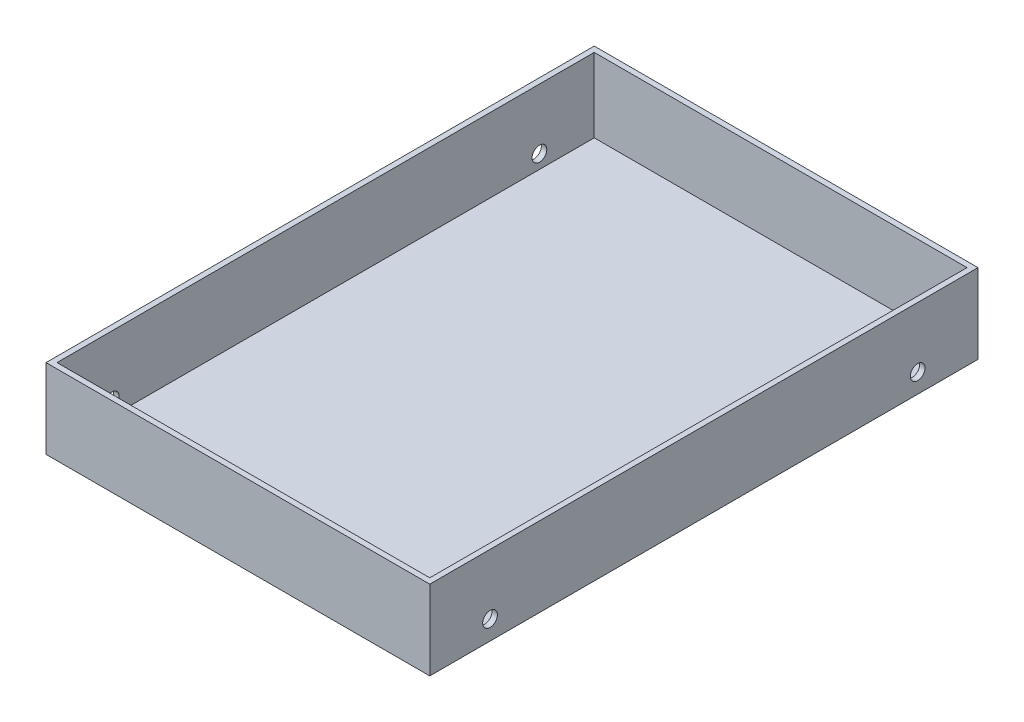
ISO-10303-21;
HEADER;
FILE_DESCRIPTION(('STEP AP214'),'2;1');
FILE_NAME('part.step','',(''),(''),'','','');
FILE_SCHEMA(('AUTOMOTIVE_DESIGN { 1 0 10303 214 1 1 1 1 }'));
ENDSEC;
DATA;
#1=APPLICATION_CONTEXT('core data for automotive mechanical design processes');
#2=APPLICATION_PROTOCOL_DEFINITION('international standard','automotive_design',2000,#1);
#3=PRODUCT_CONTEXT('',#1,'mechanical');
#4=PRODUCT('Part','Part','',(#3));
#5=PRODUCT_RELATED_PRODUCT_CATEGORY('part','',(#4));
#6=PRODUCT_DEFINITION_FORMATION('','',#4);
#7=PRODUCT_DEFINITION_CONTEXT('part definition',#1,'design');
#8=PRODUCT_DEFINITION('design','',#6,#7);
#9=PRODUCT_DEFINITION_SHAPE('','',#8);
#10=(LENGTH_UNIT() NAMED_UNIT(*) SI_UNIT(.MILLI.,.METRE.));
#11=(NAMED_UNIT(*) PLANE_ANGLE_UNIT() SI_UNIT($,.RADIAN.));
#12=(NAMED_UNIT(*) SI_UNIT($,.STERADIAN.) SOLID_ANGLE_UNIT());
#13=UNCERTAINTY_MEASURE_WITH_UNIT(LENGTH_MEASURE(1.E-05),#10,'distance_accuracy_value','');
#14=(GEOMETRIC_REPRESENTATION_CONTEXT(3) GLOBAL_UNCERTAINTY_ASSIGNED_CONTEXT((#13)) GLOBAL_UNIT_ASSIGNED_CONTEXT((#10,
#11,#12)) REPRESENTATION_CONTEXT('',''));
#15=CARTESIAN_POINT('',(0.,0.,0.));
#16=DIRECTION('',(0.,0.,1.));
#17=DIRECTION('',(1.,0.,0.));
#18=AXIS2_PLACEMENT_3D('',#15,#16,#17);
#19=CARTESIAN_POINT('',(0.,72.5,0.));
#20=DIRECTION('',(0.,-1.,0.));
#21=DIRECTION('',(0.,0.,-1.));
#22=AXIS2_PLACEMENT_3D('',#19,#20,#21);
#23=PLANE('',#22);
#24=DIRECTION('',(0.,0.,-1.));
#25=VECTOR('',#24,1.);
#26=CARTESIAN_POINT('',(175.,72.5,250.));
#27=LINE('',#26,#25);
#28=CARTESIAN_POINT('',(175.,72.5,250.));
#29=VERTEX_POINT('',#28);
#30=CARTESIAN_POINT('',(175.,72.5,-250.));
#31=VERTEX_POINT('',#30);
#32=EDGE_CURVE('E143',#29,#31,#27,.T.);
#33=ORIENTED_EDGE('',*,*,#32,.T.);
#34=DIRECTION('',(-1.,0.,0.));
#35=VECTOR('',#34,1.);
#36=CARTESIAN_POINT('',(-175.,72.5,-250.));
#37=LINE('',#36,#35);
#38=CARTESIAN_POINT('',(-175.,72.5,-250.));
#39=VERTEX_POINT('',#38);
#40=EDGE_CURVE('E87',#31,#39,#37,.T.);
#41=ORIENTED_EDGE('',*,*,#40,.T.);
#42=DIRECTION('',(0.,0.,1.));
#43=VECTOR('',#42,1.);
#44=CARTESIAN_POINT('',(-175.,72.5,250.));
#45=LINE('',#44,#43);
#46=CARTESIAN_POINT('',(-175.,72.5,250.));
#47=VERTEX_POINT('',#46);
#48=EDGE_CURVE('E146',#39,#47,#45,.T.);
#49=ORIENTED_EDGE('',*,*,#48,.T.);
#50=DIRECTION('',(1.,0.,0.));
#51=VECTOR('',#50,1.);
#52=CARTESIAN_POINT('',(-175.,72.5,250.));
#53=LINE('',#52,#51);
#54=EDGE_CURVE('E59',#47,#29,#53,.T.);
#55=ORIENTED_EDGE('',*,*,#54,.T.);
#56=EDGE_LOOP('',(#33,#41,#49,#55));
#57=FACE_BOUND('',#56,.T.);
#58=DIRECTION('',(0.,0.,-1.));
#59=VECTOR('',#58,1.);
#60=CARTESIAN_POINT('',(170.,72.5,0.));
#61=LINE('',#60,#59);
#62=CARTESIAN_POINT('',(170.,72.5,245.));
#63=VERTEX_POINT('',#62);
#64=CARTESIAN_POINT('',(170.,72.5,-245.));
#65=VERTEX_POINT('',#64);
#66=EDGE_CURVE('E132',#63,#65,#61,.T.);
#67=ORIENTED_EDGE('',*,*,#66,.F.);
#68=DIRECTION('',(1.,0.,0.));
#69=VECTOR('',#68,1.);
#70=CARTESIAN_POINT('',(0.,72.5,245.));
#71=LINE('',#70,#69);
#72=CARTESIAN_POINT('',(-170.,72.5,245.));
#73=VERTEX_POINT('',#72);
#74=EDGE_CURVE('E141',#73,#63,#71,.T.);
#75=ORIENTED_EDGE('',*,*,#74,.F.);
#76=DIRECTION('',(0.,0.,1.));
#77=VECTOR('',#76,1.);
#78=CARTESIAN_POINT('',(-170.,72.5,0.));
#79=LINE('',#78,#77);
#80=CARTESIAN_POINT('',(-170.,72.5,-245.));
#81=VERTEX_POINT('',#80);
#82=EDGE_CURVE('E139',#81,#73,#79,.T.);
#83=ORIENTED_EDGE('',*,*,#82,.F.);
#84=DIRECTION('',(-1.,0.,0.));
#85=VECTOR('',#84,1.);
#86=CARTESIAN_POINT('',(0.,72.5,-245.));
#87=LINE('',#86,#85);
#88=EDGE_CURVE('E124',#65,#81,#87,.T.);
#89=ORIENTED_EDGE('',*,*,#88,.F.);
#90=EDGE_LOOP('',(#67,#75,#83,#89));
#91=FACE_BOUND('',#90,.T.);
#92=ADVANCED_FACE('F33',(#57,#91),#23,.F.);
#93=CARTESIAN_POINT('',(175.,72.5,250.));
#94=DIRECTION('',(-1.,0.,0.));
#95=DIRECTION('',(0.,0.,1.));
#96=AXIS2_PLACEMENT_3D('',#93,#94,#95);
#97=PLANE('',#96);
#98=CARTESIAN_POINT('',(175.,17.5,195.));
#99=DIRECTION('',(-1.,0.,0.));
#100=DIRECTION('',(0.,0.,1.));
#101=AXIS2_PLACEMENT_3D('',#98,#99,#100);
#102=CIRCLE('',#101,6.7231310807878);
#103=CARTESIAN_POINT('',(175.,17.5,201.723131080788));
#104=VERTEX_POINT('',#103);
#105=EDGE_CURVE('E184',#104,#104,#102,.T.);
#106=ORIENTED_EDGE('',*,*,#105,.T.);
#107=EDGE_LOOP('',(#106));
#108=FACE_BOUND('',#107,.T.);
#109=CARTESIAN_POINT('',(175.,17.5,-195.));
#110=DIRECTION('',(-1.,0.,0.));
#111=DIRECTION('',(0.,0.,1.));
#112=AXIS2_PLACEMENT_3D('',#109,#110,#111);
#113=CIRCLE('',#112,6.7231310807878);
#114=CARTESIAN_POINT('',(175.,17.5,-188.276868919212));
#115=VERTEX_POINT('',#114);
#116=EDGE_CURVE('E169',#115,#115,#113,.T.);
#117=ORIENTED_EDGE('',*,*,#116,.T.);
#118=EDGE_LOOP('',(#117));
#119=FACE_BOUND('',#118,.T.);
#120=DIRECTION('',(0.,0.,-1.));
#121=VECTOR('',#120,1.);
#122=CARTESIAN_POINT('',(175.,0.,250.));
#123=LINE('',#122,#121);
#124=CARTESIAN_POINT('',(175.,0.,250.));
#125=VERTEX_POINT('',#124);
#126=CARTESIAN_POINT('',(175.,0.,-250.));
#127=VERTEX_POINT('',#126);
#128=EDGE_CURVE('E150',#125,#127,#123,.T.);
#129=ORIENTED_EDGE('',*,*,#128,.T.);
#130=DIRECTION('',(0.,-1.,0.));
#131=VECTOR('',#130,1.);
#132=CARTESIAN_POINT('',(175.,72.5,-250.));
#133=LINE('',#132,#131);
#134=EDGE_CURVE('E11',#31,#127,#133,.T.);
#135=ORIENTED_EDGE('',*,*,#134,.F.);
#136=ORIENTED_EDGE('',*,*,#32,.F.);
#137=DIRECTION('',(0.,-1.,0.));
#138=VECTOR('',#137,1.);
#139=CARTESIAN_POINT('',(175.,72.5,250.));
#140=LINE('',#139,#138);
#141=EDGE_CURVE('E149',#29,#125,#140,.T.);
#142=ORIENTED_EDGE('',*,*,#141,.T.);
#143=EDGE_LOOP('',(#129,#135,#136,#142));
#144=FACE_BOUND('',#143,.T.);
#145=ADVANCED_FACE('F35',(#108,#119,#144),#97,.F.);
#146=CARTESIAN_POINT('',(-175.,72.5,-250.));
#147=DIRECTION('',(0.,0.,1.));
#148=DIRECTION('',(1.,0.,0.));
#149=AXIS2_PLACEMENT_3D('',#146,#147,#148);
#150=PLANE('',#149);
#151=DIRECTION('',(-1.,0.,0.));
#152=VECTOR('',#151,1.);
#153=CARTESIAN_POINT('',(-175.,0.,-250.));
#154=LINE('',#153,#152);
#155=CARTESIAN_POINT('',(-175.,0.,-250.));
#156=VERTEX_POINT('',#155);
#157=EDGE_CURVE('E153',#127,#156,#154,.T.);
#158=ORIENTED_EDGE('',*,*,#157,.T.);
#159=DIRECTION('',(0.,-1.,0.));
#160=VECTOR('',#159,1.);
#161=CARTESIAN_POINT('',(-175.,72.5,-250.));
#162=LINE('',#161,#160);
#163=EDGE_CURVE('E42',#39,#156,#162,.T.);
#164=ORIENTED_EDGE('',*,*,#163,.F.);
#165=ORIENTED_EDGE('',*,*,#40,.F.);
#166=ORIENTED_EDGE('',*,*,#134,.T.);
#167=EDGE_LOOP('',(#158,#164,#165,#166));
#168=FACE_BOUND('',#167,.T.);
#169=ADVANCED_FACE('F202',(#168),#150,.F.);
#170=CARTESIAN_POINT('',(-175.,72.5,250.));
#171=DIRECTION('',(1.,0.,0.));
#172=DIRECTION('',(0.,0.,-1.));
#173=AXIS2_PLACEMENT_3D('',#170,#171,#172);
#174=PLANE('',#173);
#175=CARTESIAN_POINT('',(-175.,17.5,195.));
#176=DIRECTION('',(1.,0.,0.));
#177=DIRECTION('',(0.,0.,-1.));
#178=AXIS2_PLACEMENT_3D('',#175,#176,#177);
#179=CIRCLE('',#178,6.7231310807878);
#180=CARTESIAN_POINT('',(-175.,17.5,188.276868919212));
#181=VERTEX_POINT('',#180);
#182=EDGE_CURVE('E165',#181,#181,#179,.T.);
#183=ORIENTED_EDGE('',*,*,#182,.T.);
#184=EDGE_LOOP('',(#183));
#185=FACE_BOUND('',#184,.T.);
#186=CARTESIAN_POINT('',(-175.,17.5,-195.));
#187=DIRECTION('',(1.,0.,0.));
#188=DIRECTION('',(0.,0.,1.));
#189=AXIS2_PLACEMENT_3D('',#186,#187,#188);
#190=CIRCLE('',#189,6.7231310807878);
#191=CARTESIAN_POINT('',(-175.,17.5,-188.276868919212));
#192=VERTEX_POINT('',#191);
#193=EDGE_CURVE('E172',#192,#192,#190,.T.);
#194=ORIENTED_EDGE('',*,*,#193,.T.);
#195=EDGE_LOOP('',(#194));
#196=FACE_BOUND('',#195,.T.);
#197=DIRECTION('',(0.,0.,1.));
#198=VECTOR('',#197,1.);
#199=CARTESIAN_POINT('',(-175.,0.,250.));
#200=LINE('',#199,#198);
#201=CARTESIAN_POINT('',(-175.,0.,250.));
#202=VERTEX_POINT('',#201);
#203=EDGE_CURVE('E155',#156,#202,#200,.T.);
#204=ORIENTED_EDGE('',*,*,#203,.T.);
#205=DIRECTION('',(0.,-1.,0.));
#206=VECTOR('',#205,1.);
#207=CARTESIAN_POINT('',(-175.,72.5,250.));
#208=LINE('',#207,#206);
#209=EDGE_CURVE('E159',#47,#202,#208,.T.);
#210=ORIENTED_EDGE('',*,*,#209,.F.);
#211=ORIENTED_EDGE('',*,*,#48,.F.);
#212=ORIENTED_EDGE('',*,*,#163,.T.);
#213=EDGE_LOOP('',(#204,#210,#211,#212));
#214=FACE_BOUND('',#213,.T.);
#215=ADVANCED_FACE('F214',(#185,#196,#214),#174,.F.);
#216=CARTESIAN_POINT('',(-175.,72.5,250.));
#217=DIRECTION('',(0.,0.,-1.));
#218=DIRECTION('',(-1.,0.,0.));
#219=AXIS2_PLACEMENT_3D('',#216,#217,#218);
#220=PLANE('',#219);
#221=DIRECTION('',(1.,0.,0.));
#222=VECTOR('',#221,1.);
#223=CARTESIAN_POINT('',(-175.,0.,250.));
#224=LINE('',#223,#222);
#225=EDGE_CURVE('E80',#202,#125,#224,.T.);
#226=ORIENTED_EDGE('',*,*,#225,.T.);
#227=ORIENTED_EDGE('',*,*,#141,.F.);
#228=ORIENTED_EDGE('',*,*,#54,.F.);
#229=ORIENTED_EDGE('',*,*,#209,.T.);
#230=EDGE_LOOP('',(#226,#227,#228,#229));
#231=FACE_BOUND('',#230,.T.);
#232=ADVANCED_FACE('F210',(#231),#220,.F.);
#233=CARTESIAN_POINT('',(0.,0.,0.));
#234=DIRECTION('',(0.,-1.,0.));
#235=DIRECTION('',(0.,0.,-1.));
#236=AXIS2_PLACEMENT_3D('',#233,#234,#235);
#237=PLANE('',#236);
#238=ORIENTED_EDGE('',*,*,#128,.F.);
#239=ORIENTED_EDGE('',*,*,#225,.F.);
#240=ORIENTED_EDGE('',*,*,#203,.F.);
#241=ORIENTED_EDGE('',*,*,#157,.F.);
#242=EDGE_LOOP('',(#238,#239,#240,#241));
#243=FACE_BOUND('',#242,.T.);
#244=ADVANCED_FACE('F207',(#243),#237,.T.);
#245=CARTESIAN_POINT('',(170.,72.5,250.));
#246=DIRECTION('',(-1.,0.,0.));
#247=DIRECTION('',(0.,0.,1.));
#248=AXIS2_PLACEMENT_3D('',#245,#246,#247);
#249=PLANE('',#248);
#250=CARTESIAN_POINT('',(170.,17.5,195.));
#251=DIRECTION('',(-1.,0.,0.));
#252=DIRECTION('',(0.,0.,1.));
#253=AXIS2_PLACEMENT_3D('',#250,#251,#252);
#254=CIRCLE('',#253,6.7231310807878);
#255=CARTESIAN_POINT('',(170.,17.5,201.723131080788));
#256=VERTEX_POINT('',#255);
#257=EDGE_CURVE('E181',#256,#256,#254,.T.);
#258=ORIENTED_EDGE('',*,*,#257,.F.);
#259=EDGE_LOOP('',(#258));
#260=FACE_BOUND('',#259,.T.);
#261=CARTESIAN_POINT('',(170.,17.5,-195.));
#262=DIRECTION('',(-1.,0.,0.));
#263=DIRECTION('',(0.,0.,1.));
#264=AXIS2_PLACEMENT_3D('',#261,#262,#263);
#265=CIRCLE('',#264,6.7231310807878);
#266=CARTESIAN_POINT('',(170.,17.5,-188.276868919212));
#267=VERTEX_POINT('',#266);
#268=EDGE_CURVE('E164',#267,#267,#265,.T.);
#269=ORIENTED_EDGE('',*,*,#268,.F.);
#270=EDGE_LOOP('',(#269));
#271=FACE_BOUND('',#270,.T.);
#272=DIRECTION('',(0.,0.,-1.));
#273=VECTOR('',#272,1.);
#274=CARTESIAN_POINT('',(170.,5.,0.));
#275=LINE('',#274,#273);
#276=CARTESIAN_POINT('',(170.,5.,245.));
#277=VERTEX_POINT('',#276);
#278=CARTESIAN_POINT('',(170.,5.,-245.));
#279=VERTEX_POINT('',#278);
#280=EDGE_CURVE('E115',#277,#279,#275,.T.);
#281=ORIENTED_EDGE('',*,*,#280,.F.);
#282=DIRECTION('',(0.,-1.,0.));
#283=VECTOR('',#282,1.);
#284=CARTESIAN_POINT('',(170.,72.5,245.));
#285=LINE('',#284,#283);
#286=EDGE_CURVE('E135',#63,#277,#285,.T.);
#287=ORIENTED_EDGE('',*,*,#286,.F.);
#288=ORIENTED_EDGE('',*,*,#66,.T.);
#289=DIRECTION('',(0.,-1.,0.));
#290=VECTOR('',#289,1.);
#291=CARTESIAN_POINT('',(170.,72.5,-245.));
#292=LINE('',#291,#290);
#293=EDGE_CURVE('E127',#65,#279,#292,.T.);
#294=ORIENTED_EDGE('',*,*,#293,.T.);
#295=EDGE_LOOP('',(#281,#287,#288,#294));
#296=FACE_BOUND('',#295,.T.);
#297=ADVANCED_FACE('F195',(#260,#271,#296),#249,.T.);
#298=CARTESIAN_POINT('',(-175.,72.5,-245.));
#299=DIRECTION('',(0.,0.,1.));
#300=DIRECTION('',(1.,0.,0.));
#301=AXIS2_PLACEMENT_3D('',#298,#299,#300);
#302=PLANE('',#301);
#303=DIRECTION('',(-1.,0.,0.));
#304=VECTOR('',#303,1.);
#305=CARTESIAN_POINT('',(0.,5.,-245.));
#306=LINE('',#305,#304);
#307=CARTESIAN_POINT('',(-170.,5.,-245.));
#308=VERTEX_POINT('',#307);
#309=EDGE_CURVE('E109',#279,#308,#306,.T.);
#310=ORIENTED_EDGE('',*,*,#309,.F.);
#311=ORIENTED_EDGE('',*,*,#293,.F.);
#312=ORIENTED_EDGE('',*,*,#88,.T.);
#313=DIRECTION('',(0.,-1.,0.));
#314=VECTOR('',#313,1.);
#315=CARTESIAN_POINT('',(-170.,72.5,-245.));
#316=LINE('',#315,#314);
#317=EDGE_CURVE('E121',#81,#308,#316,.T.);
#318=ORIENTED_EDGE('',*,*,#317,.T.);
#319=EDGE_LOOP('',(#310,#311,#312,#318));
#320=FACE_BOUND('',#319,.T.);
#321=ADVANCED_FACE('F122',(#320),#302,.T.);
#322=CARTESIAN_POINT('',(-170.,72.5,250.));
#323=DIRECTION('',(1.,0.,0.));
#324=DIRECTION('',(0.,0.,-1.));
#325=AXIS2_PLACEMENT_3D('',#322,#323,#324);
#326=PLANE('',#325);
#327=CARTESIAN_POINT('',(-170.,17.5,195.));
#328=DIRECTION('',(1.,0.,0.));
#329=DIRECTION('',(0.,0.,-1.));
#330=AXIS2_PLACEMENT_3D('',#327,#328,#329);
#331=CIRCLE('',#330,6.7231310807878);
#332=CARTESIAN_POINT('',(-170.,17.5,188.276868919212));
#333=VERTEX_POINT('',#332);
#334=EDGE_CURVE('E37',#333,#333,#331,.T.);
#335=ORIENTED_EDGE('',*,*,#334,.F.);
#336=EDGE_LOOP('',(#335));
#337=FACE_BOUND('',#336,.T.);
#338=CARTESIAN_POINT('',(-170.,17.5,-195.));
#339=DIRECTION('',(1.,0.,0.));
#340=DIRECTION('',(0.,0.,-1.));
#341=AXIS2_PLACEMENT_3D('',#338,#339,#340);
#342=CIRCLE('',#341,6.7231310807878);
#343=CARTESIAN_POINT('',(-170.,17.5,-201.723131080788));
#344=VERTEX_POINT('',#343);
#345=EDGE_CURVE('E162',#344,#344,#342,.T.);
#346=ORIENTED_EDGE('',*,*,#345,.F.);
#347=EDGE_LOOP('',(#346));
#348=FACE_BOUND('',#347,.T.);
#349=DIRECTION('',(0.,0.,1.));
#350=VECTOR('',#349,1.);
#351=CARTESIAN_POINT('',(-170.,5.,0.));
#352=LINE('',#351,#350);
#353=CARTESIAN_POINT('',(-170.,5.,245.));
#354=VERTEX_POINT('',#353);
#355=EDGE_CURVE('E113',#308,#354,#352,.T.);
#356=ORIENTED_EDGE('',*,*,#355,.F.);
#357=ORIENTED_EDGE('',*,*,#317,.F.);
#358=ORIENTED_EDGE('',*,*,#82,.T.);
#359=DIRECTION('',(0.,-1.,0.));
#360=VECTOR('',#359,1.);
#361=CARTESIAN_POINT('',(-170.,72.5,245.));
#362=LINE('',#361,#360);
#363=EDGE_CURVE('E50',#73,#354,#362,.T.);
#364=ORIENTED_EDGE('',*,*,#363,.T.);
#365=EDGE_LOOP('',(#356,#357,#358,#364));
#366=FACE_BOUND('',#365,.T.);
#367=ADVANCED_FACE('F129',(#337,#348,#366),#326,.T.);
#368=CARTESIAN_POINT('',(-175.,72.5,245.));
#369=DIRECTION('',(0.,0.,-1.));
#370=DIRECTION('',(-1.,0.,0.));
#371=AXIS2_PLACEMENT_3D('',#368,#369,#370);
#372=PLANE('',#371);
#373=DIRECTION('',(1.,0.,0.));
#374=VECTOR('',#373,1.);
#375=CARTESIAN_POINT('',(0.,5.,245.));
#376=LINE('',#375,#374);
#377=EDGE_CURVE('E130',#354,#277,#376,.T.);
#378=ORIENTED_EDGE('',*,*,#377,.F.);
#379=ORIENTED_EDGE('',*,*,#363,.F.);
#380=ORIENTED_EDGE('',*,*,#74,.T.);
#381=ORIENTED_EDGE('',*,*,#286,.T.);
#382=EDGE_LOOP('',(#378,#379,#380,#381));
#383=FACE_BOUND('',#382,.T.);
#384=ADVANCED_FACE('F191',(#383),#372,.T.);
#385=CARTESIAN_POINT('',(0.,5.,0.));
#386=DIRECTION('',(0.,-1.,0.));
#387=DIRECTION('',(0.,0.,-1.));
#388=AXIS2_PLACEMENT_3D('',#385,#386,#387);
#389=PLANE('',#388);
#390=ORIENTED_EDGE('',*,*,#280,.T.);
#391=ORIENTED_EDGE('',*,*,#309,.T.);
#392=ORIENTED_EDGE('',*,*,#355,.T.);
#393=ORIENTED_EDGE('',*,*,#377,.T.);
#394=EDGE_LOOP('',(#390,#391,#392,#393));
#395=FACE_BOUND('',#394,.T.);
#396=ADVANCED_FACE('F111',(#395),#389,.F.);
#397=CARTESIAN_POINT('',(-175.,17.5,-195.));
#398=DIRECTION('',(1.,0.,0.));
#399=DIRECTION('',(0.,0.,-1.));
#400=AXIS2_PLACEMENT_3D('',#397,#398,#399);
#401=CYLINDRICAL_SURFACE('',#400,6.7231310807878);
#402=ORIENTED_EDGE('',*,*,#345,.T.);
#403=EDGE_LOOP('',(#402));
#404=FACE_BOUND('',#403,.T.);
#405=ORIENTED_EDGE('',*,*,#193,.F.);
#406=EDGE_LOOP('',(#405));
#407=FACE_BOUND('',#406,.T.);
#408=ADVANCED_FACE('F273',(#404,#407),#401,.F.);
#409=CARTESIAN_POINT('',(-175.,17.5,195.));
#410=DIRECTION('',(1.,0.,0.));
#411=DIRECTION('',(0.,0.,-1.));
#412=AXIS2_PLACEMENT_3D('',#409,#410,#411);
#413=CYLINDRICAL_SURFACE('',#412,6.7231310807878);
#414=ORIENTED_EDGE('',*,*,#334,.T.);
#415=EDGE_LOOP('',(#414));
#416=FACE_BOUND('',#415,.T.);
#417=ORIENTED_EDGE('',*,*,#182,.F.);
#418=EDGE_LOOP('',(#417));
#419=FACE_BOUND('',#418,.T.);
#420=ADVANCED_FACE('F278',(#416,#419),#413,.F.);
#421=ORIENTED_EDGE('',*,*,#268,.T.);
#422=EDGE_LOOP('',(#421));
#423=FACE_BOUND('',#422,.T.);
#424=ORIENTED_EDGE('',*,*,#116,.F.);
#425=EDGE_LOOP('',(#424));
#426=FACE_BOUND('',#425,.T.);
#427=ADVANCED_FACE('F280',(#423,#426),#401,.F.);
#428=ORIENTED_EDGE('',*,*,#257,.T.);
#429=EDGE_LOOP('',(#428));
#430=FACE_BOUND('',#429,.T.);
#431=ORIENTED_EDGE('',*,*,#105,.F.);
#432=EDGE_LOOP('',(#431));
#433=FACE_BOUND('',#432,.T.);
#434=ADVANCED_FACE('F288',(#430,#433),#413,.F.);
#435=CLOSED_SHELL('',(#92,#145,#169,#215,#232,#244,#297,#321,#367,#384,#396,#408,#420,#427,#434));
#436=MANIFOLD_SOLID_BREP('B2',#435);
#437=ADVANCED_BREP_SHAPE_REPRESENTATION('',(#18,#436),#14);
#438=SHAPE_DEFINITION_REPRESENTATION(#9,#437);
ENDSEC;
END-ISO-10303-21;
